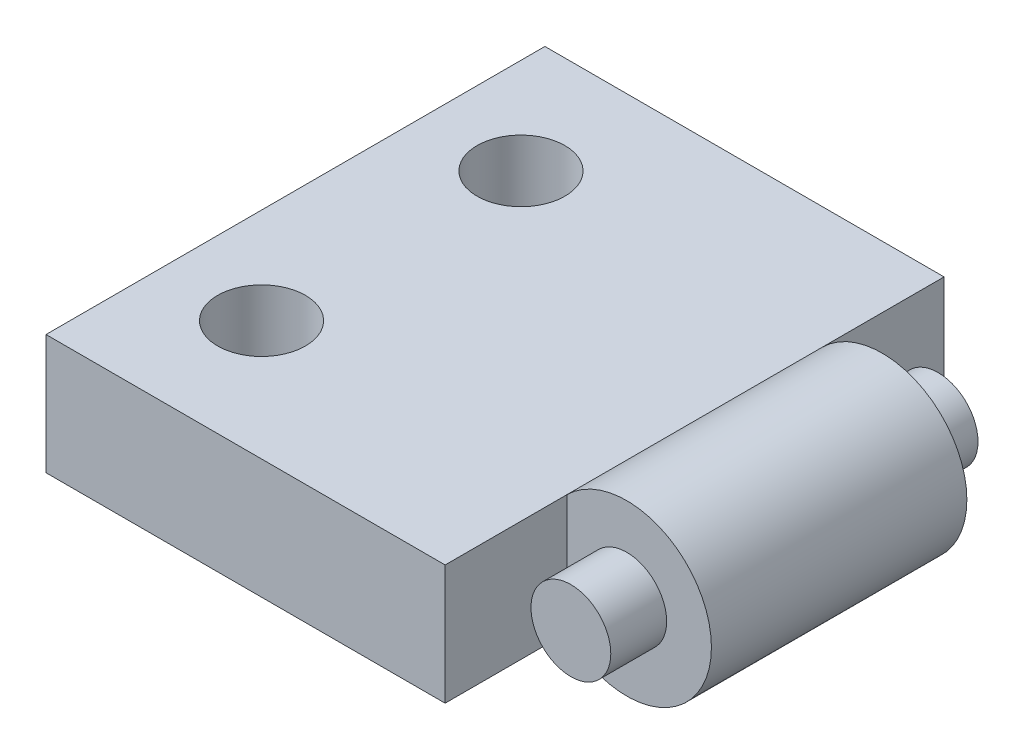
ISO-10303-21;
HEADER;
FILE_DESCRIPTION(('STEP AP214'),'2;1');
FILE_NAME('part.step','',(''),(''),'','','');
FILE_SCHEMA(('AUTOMOTIVE_DESIGN { 1 0 10303 214 1 1 1 1 }'));
ENDSEC;
DATA;
#1=APPLICATION_CONTEXT('core data for automotive mechanical design processes');
#2=APPLICATION_PROTOCOL_DEFINITION('international standard','automotive_design',2000,#1);
#3=PRODUCT_CONTEXT('',#1,'mechanical');
#4=PRODUCT('Part','Part','',(#3));
#5=PRODUCT_RELATED_PRODUCT_CATEGORY('part','',(#4));
#6=PRODUCT_DEFINITION_FORMATION('','',#4);
#7=PRODUCT_DEFINITION_CONTEXT('part definition',#1,'design');
#8=PRODUCT_DEFINITION('design','',#6,#7);
#9=PRODUCT_DEFINITION_SHAPE('','',#8);
#10=(LENGTH_UNIT() NAMED_UNIT(*) SI_UNIT(.MILLI.,.METRE.));
#11=(NAMED_UNIT(*) PLANE_ANGLE_UNIT() SI_UNIT($,.RADIAN.));
#12=(NAMED_UNIT(*) SI_UNIT($,.STERADIAN.) SOLID_ANGLE_UNIT());
#13=UNCERTAINTY_MEASURE_WITH_UNIT(LENGTH_MEASURE(1.E-05),#10,'distance_accuracy_value','');
#14=(GEOMETRIC_REPRESENTATION_CONTEXT(3) GLOBAL_UNCERTAINTY_ASSIGNED_CONTEXT((#13)) GLOBAL_UNIT_ASSIGNED_CONTEXT((#10,
#11,#12)) REPRESENTATION_CONTEXT('',''));
#15=CARTESIAN_POINT('',(0.,0.,0.));
#16=DIRECTION('',(0.,0.,1.));
#17=DIRECTION('',(1.,0.,0.));
#18=AXIS2_PLACEMENT_3D('',#15,#16,#17);
#19=CARTESIAN_POINT('',(12.7,3.81,0.));
#20=DIRECTION('',(-1.,0.,0.));
#21=DIRECTION('',(0.,0.,1.));
#22=AXIS2_PLACEMENT_3D('',#19,#20,#21);
#23=PLANE('',#22);
#24=DIRECTION('',(0.,1.,0.));
#25=VECTOR('',#24,1.);
#26=CARTESIAN_POINT('',(12.7,3.81,-12.0015));
#27=LINE('',#26,#25);
#28=CARTESIAN_POINT('',(12.7,0.,-12.0015));
#29=VERTEX_POINT('',#28);
#30=CARTESIAN_POINT('',(12.7,3.81,-12.0015));
#31=VERTEX_POINT('',#30);
#32=EDGE_CURVE('E101',#29,#31,#27,.T.);
#33=ORIENTED_EDGE('',*,*,#32,.F.);
#34=DIRECTION('',(0.,0.,-1.));
#35=VECTOR('',#34,1.);
#36=CARTESIAN_POINT('',(12.7,0.,0.));
#37=LINE('',#36,#35);
#38=CARTESIAN_POINT('',(12.6999999999999,0.,-15.875));
#39=VERTEX_POINT('',#38);
#40=EDGE_CURVE('E89',#29,#39,#37,.T.);
#41=ORIENTED_EDGE('',*,*,#40,.T.);
#42=DIRECTION('',(0.,-1.,0.));
#43=VECTOR('',#42,1.);
#44=CARTESIAN_POINT('',(12.6999999999999,3.81,-15.875));
#45=LINE('',#44,#43);
#46=CARTESIAN_POINT('',(12.6999999999999,3.81,-15.875));
#47=VERTEX_POINT('',#46);
#48=EDGE_CURVE('E140',#47,#39,#45,.T.);
#49=ORIENTED_EDGE('',*,*,#48,.F.);
#50=DIRECTION('',(0.,0.,-1.));
#51=VECTOR('',#50,1.);
#52=CARTESIAN_POINT('',(12.7,3.81,0.));
#53=LINE('',#52,#51);
#54=EDGE_CURVE('E50',#31,#47,#53,.T.);
#55=ORIENTED_EDGE('',*,*,#54,.F.);
#56=EDGE_LOOP('',(#33,#41,#49,#55));
#57=FACE_BOUND('',#56,.T.);
#58=ADVANCED_FACE('F35',(#57),#23,.F.);
#59=CARTESIAN_POINT('',(0.,3.81,-15.875));
#60=DIRECTION('',(0.,0.,-1.));
#61=DIRECTION('',(-1.,0.,0.));
#62=AXIS2_PLACEMENT_3D('',#59,#60,#61);
#63=PLANE('',#62);
#64=DIRECTION('',(1.,0.,0.));
#65=VECTOR('',#64,1.);
#66=CARTESIAN_POINT('',(0.,0.,-15.875));
#67=LINE('',#66,#65);
#68=CARTESIAN_POINT('',(0.,0.,-15.875));
#69=VERTEX_POINT('',#68);
#70=EDGE_CURVE('E95',#69,#39,#67,.T.);
#71=ORIENTED_EDGE('',*,*,#70,.F.);
#72=DIRECTION('',(0.,-1.,0.));
#73=VECTOR('',#72,1.);
#74=CARTESIAN_POINT('',(0.,3.81,-15.875));
#75=LINE('',#74,#73);
#76=CARTESIAN_POINT('',(0.,3.81,-15.875));
#77=VERTEX_POINT('',#76);
#78=EDGE_CURVE('E43',#77,#69,#75,.T.);
#79=ORIENTED_EDGE('',*,*,#78,.F.);
#80=DIRECTION('',(1.,0.,0.));
#81=VECTOR('',#80,1.);
#82=CARTESIAN_POINT('',(0.,3.81,-15.875));
#83=LINE('',#82,#81);
#84=EDGE_CURVE('E129',#77,#47,#83,.T.);
#85=ORIENTED_EDGE('',*,*,#84,.T.);
#86=ORIENTED_EDGE('',*,*,#48,.T.);
#87=EDGE_LOOP('',(#71,#79,#85,#86));
#88=FACE_BOUND('',#87,.T.);
#89=ADVANCED_FACE('F162',(#88),#63,.T.);
#90=CARTESIAN_POINT('',(0.,3.81,0.));
#91=DIRECTION('',(-1.,0.,0.));
#92=DIRECTION('',(0.,0.,1.));
#93=AXIS2_PLACEMENT_3D('',#90,#91,#92);
#94=PLANE('',#93);
#95=DIRECTION('',(0.,0.,-1.));
#96=VECTOR('',#95,1.);
#97=CARTESIAN_POINT('',(0.,0.,0.));
#98=LINE('',#97,#96);
#99=CARTESIAN_POINT('',(0.,0.,0.));
#100=VERTEX_POINT('',#99);
#101=EDGE_CURVE('E147',#100,#69,#98,.T.);
#102=ORIENTED_EDGE('',*,*,#101,.F.);
#103=DIRECTION('',(0.,-1.,0.));
#104=VECTOR('',#103,1.);
#105=CARTESIAN_POINT('',(0.,3.81,0.));
#106=LINE('',#105,#104);
#107=CARTESIAN_POINT('',(0.,3.81,0.));
#108=VERTEX_POINT('',#107);
#109=EDGE_CURVE('E155',#108,#100,#106,.T.);
#110=ORIENTED_EDGE('',*,*,#109,.F.);
#111=DIRECTION('',(0.,0.,-1.));
#112=VECTOR('',#111,1.);
#113=CARTESIAN_POINT('',(0.,3.81,0.));
#114=LINE('',#113,#112);
#115=EDGE_CURVE('E132',#108,#77,#114,.T.);
#116=ORIENTED_EDGE('',*,*,#115,.T.);
#117=ORIENTED_EDGE('',*,*,#78,.T.);
#118=EDGE_LOOP('',(#102,#110,#116,#117));
#119=FACE_BOUND('',#118,.T.);
#120=ADVANCED_FACE('F158',(#119),#94,.T.);
#121=CARTESIAN_POINT('',(0.,3.81,0.));
#122=DIRECTION('',(0.,0.,-1.));
#123=DIRECTION('',(-1.,0.,0.));
#124=AXIS2_PLACEMENT_3D('',#121,#122,#123);
#125=PLANE('',#124);
#126=DIRECTION('',(1.,0.,0.));
#127=VECTOR('',#126,1.);
#128=CARTESIAN_POINT('',(0.,0.,0.));
#129=LINE('',#128,#127);
#130=CARTESIAN_POINT('',(12.7,0.,0.));
#131=VERTEX_POINT('',#130);
#132=EDGE_CURVE('E97',#100,#131,#129,.T.);
#133=ORIENTED_EDGE('',*,*,#132,.T.);
#134=DIRECTION('',(0.,-1.,0.));
#135=VECTOR('',#134,1.);
#136=CARTESIAN_POINT('',(12.7,3.81,0.));
#137=LINE('',#136,#135);
#138=CARTESIAN_POINT('',(12.7,3.81,0.));
#139=VERTEX_POINT('',#138);
#140=EDGE_CURVE('E152',#139,#131,#137,.T.);
#141=ORIENTED_EDGE('',*,*,#140,.F.);
#142=DIRECTION('',(1.,0.,0.));
#143=VECTOR('',#142,1.);
#144=CARTESIAN_POINT('',(0.,3.81,0.));
#145=LINE('',#144,#143);
#146=EDGE_CURVE('E135',#108,#139,#145,.T.);
#147=ORIENTED_EDGE('',*,*,#146,.F.);
#148=ORIENTED_EDGE('',*,*,#109,.T.);
#149=EDGE_LOOP('',(#133,#141,#147,#148));
#150=FACE_BOUND('',#149,.T.);
#151=ADVANCED_FACE('F166',(#150),#125,.F.);
#152=CARTESIAN_POINT('',(3.04799999999996,3.81,-12.065));
#153=DIRECTION('',(0.,-1.,0.));
#154=DIRECTION('',(0.,0.,-1.));
#155=AXIS2_PLACEMENT_3D('',#152,#153,#154);
#156=CYLINDRICAL_SURFACE('',#155,1.397);
#157=CARTESIAN_POINT('',(3.04799999999996,3.81,-12.065));
#158=DIRECTION('',(0.,1.,0.));
#159=DIRECTION('',(0.,0.,1.));
#160=AXIS2_PLACEMENT_3D('',#157,#158,#159);
#161=CIRCLE('',#160,1.397);
#162=CARTESIAN_POINT('',(3.04799999999996,3.81,-13.462));
#163=VERTEX_POINT('',#162);
#164=EDGE_CURVE('E126',#163,#163,#161,.T.);
#165=CARTESIAN_POINT('',(3.04799999999996,0.,-12.065));
#166=DIRECTION('',(0.,1.,0.));
#167=DIRECTION('',(0.,0.,1.));
#168=AXIS2_PLACEMENT_3D('',#165,#166,#167);
#169=CIRCLE('',#168,1.397);
#170=CARTESIAN_POINT('',(3.04799999999996,0.,-13.462));
#171=VERTEX_POINT('',#170);
#172=EDGE_CURVE('E143',#171,#171,#169,.T.);
#173=CARTESIAN_POINT('',(3.04799999999996,3.81,-13.462));
#174=CARTESIAN_POINT('',(3.04799999999996,3.7703125,-13.462));
#175=CARTESIAN_POINT('',(3.04799999999996,3.730625,-13.462));
#176=CARTESIAN_POINT('',(3.04799999999996,3.65125,-13.462));
#177=CARTESIAN_POINT('',(3.04799999999996,3.6115625,-13.462));
#178=CARTESIAN_POINT('',(3.04799999999996,3.5321875,-13.462));
#179=CARTESIAN_POINT('',(3.04799999999996,3.4925,-13.462));
#180=CARTESIAN_POINT('',(3.04799999999996,3.413125,-13.462));
#181=CARTESIAN_POINT('',(3.04799999999996,3.3734375,-13.462));
#182=CARTESIAN_POINT('',(3.04799999999996,3.2940625,-13.462));
#183=CARTESIAN_POINT('',(3.04799999999996,3.254375,-13.462));
#184=CARTESIAN_POINT('',(3.04799999999996,3.175,-13.462));
#185=CARTESIAN_POINT('',(3.04799999999996,3.1353125,-13.462));
#186=CARTESIAN_POINT('',(3.04799999999996,3.0559375,-13.462));
#187=CARTESIAN_POINT('',(3.04799999999996,3.01625,-13.462));
#188=CARTESIAN_POINT('',(3.04799999999996,2.936875,-13.462));
#189=CARTESIAN_POINT('',(3.04799999999996,2.8971875,-13.462));
#190=CARTESIAN_POINT('',(3.04799999999996,2.8178125,-13.462));
#191=CARTESIAN_POINT('',(3.04799999999996,2.778125,-13.462));
#192=CARTESIAN_POINT('',(3.04799999999996,2.69875,-13.462));
#193=CARTESIAN_POINT('',(3.04799999999996,2.6590625,-13.462));
#194=CARTESIAN_POINT('',(3.04799999999996,2.5796875,-13.462));
#195=CARTESIAN_POINT('',(3.04799999999996,2.54,-13.462));
#196=CARTESIAN_POINT('',(3.04799999999996,2.460625,-13.462));
#197=CARTESIAN_POINT('',(3.04799999999996,2.4209375,-13.462));
#198=CARTESIAN_POINT('',(3.04799999999996,2.3415625,-13.462));
#199=CARTESIAN_POINT('',(3.04799999999996,2.301875,-13.462));
#200=CARTESIAN_POINT('',(3.04799999999996,2.2225,-13.462));
#201=CARTESIAN_POINT('',(3.04799999999996,2.1828125,-13.462));
#202=CARTESIAN_POINT('',(3.04799999999996,2.1034375,-13.462));
#203=CARTESIAN_POINT('',(3.04799999999996,2.06375,-13.462));
#204=CARTESIAN_POINT('',(3.04799999999996,1.984375,-13.462));
#205=CARTESIAN_POINT('',(3.04799999999996,1.9446875,-13.462));
#206=CARTESIAN_POINT('',(3.04799999999996,1.8653125,-13.462));
#207=CARTESIAN_POINT('',(3.04799999999996,1.825625,-13.462));
#208=CARTESIAN_POINT('',(3.04799999999996,1.74625,-13.462));
#209=CARTESIAN_POINT('',(3.04799999999996,1.7065625,-13.462));
#210=CARTESIAN_POINT('',(3.04799999999996,1.6271875,-13.462));
#211=CARTESIAN_POINT('',(3.04799999999996,1.5875,-13.462));
#212=CARTESIAN_POINT('',(3.04799999999996,1.508125,-13.462));
#213=CARTESIAN_POINT('',(3.04799999999996,1.4684375,-13.462));
#214=CARTESIAN_POINT('',(3.04799999999996,1.3890625,-13.462));
#215=CARTESIAN_POINT('',(3.04799999999996,1.349375,-13.462));
#216=CARTESIAN_POINT('',(3.04799999999996,1.27,-13.462));
#217=CARTESIAN_POINT('',(3.04799999999996,1.2303125,-13.462));
#218=CARTESIAN_POINT('',(3.04799999999996,1.1509375,-13.462));
#219=CARTESIAN_POINT('',(3.04799999999996,1.11125,-13.462));
#220=CARTESIAN_POINT('',(3.04799999999996,1.031875,-13.462));
#221=CARTESIAN_POINT('',(3.04799999999996,0.9921875,-13.462));
#222=CARTESIAN_POINT('',(3.04799999999996,0.9128125,-13.462));
#223=CARTESIAN_POINT('',(3.04799999999996,0.873125,-13.462));
#224=CARTESIAN_POINT('',(3.04799999999996,0.79375,-13.462));
#225=CARTESIAN_POINT('',(3.04799999999996,0.7540625,-13.462));
#226=CARTESIAN_POINT('',(3.04799999999996,0.6746875,-13.462));
#227=CARTESIAN_POINT('',(3.04799999999996,0.635,-13.462));
#228=CARTESIAN_POINT('',(3.04799999999996,0.555625,-13.462));
#229=CARTESIAN_POINT('',(3.04799999999996,0.5159375,-13.462));
#230=CARTESIAN_POINT('',(3.04799999999996,0.4365625,-13.462));
#231=CARTESIAN_POINT('',(3.04799999999996,0.396875,-13.462));
#232=CARTESIAN_POINT('',(3.04799999999996,0.3175,-13.462));
#233=CARTESIAN_POINT('',(3.04799999999996,0.2778125,-13.462));
#234=CARTESIAN_POINT('',(3.04799999999996,0.1984375,-13.462));
#235=CARTESIAN_POINT('',(3.04799999999996,0.15875,-13.462));
#236=CARTESIAN_POINT('',(3.04799999999996,0.0793749999999999,-13.462));
#237=CARTESIAN_POINT('',(3.04799999999996,0.0396874999999999,-13.462));
#238=CARTESIAN_POINT('',(3.04799999999996,0.,-13.462));
#239=B_SPLINE_CURVE_WITH_KNOTS('',3,(#173,#174,#175,#176,#177,#178,#179,#180,#181,#182,#183,
#184,#185,#186,#187,#188,#189,#190,#191,#192,#193,#194,#195,#196,#197,#198,#199,#200,#201,#202,
#203,#204,#205,#206,#207,#208,#209,#210,#211,#212,#213,#214,#215,#216,#217,#218,#219,#220,#221,
#222,#223,#224,#225,#226,#227,#228,#229,#230,#231,#232,#233,#234,#235,#236,#237,#238),
.UNSPECIFIED.,.F.,.F.,(4,2,2,2,2,2,2,2,2,2,2,2,2,2,2,2,2,2,2,2,2,2,2,2,2,2,2,2,2,2,2,2,4),(0.,
0.1190625,0.238125,0.3571875,0.47625,0.5953125,0.714375,0.8334375,0.9525,1.0715625,1.190625,
1.3096875,1.42875,1.5478125,1.666875,1.7859375,1.905,2.0240625,2.143125,2.2621875,2.38125,
2.5003125,2.619375,2.7384375,2.8575,2.9765625,3.095625,3.2146875,3.33375,3.4528125,3.571875,
3.6909375,3.81),.UNSPECIFIED.);
#240=EDGE_CURVE('BSEAM201',#163,#171,#239,.T.);
#241=ORIENTED_EDGE('',*,*,#164,.T.);
#242=ORIENTED_EDGE('',*,*,#172,.F.);
#243=ORIENTED_EDGE('',*,*,#240,.T.);
#244=ORIENTED_EDGE('',*,*,#240,.F.);
#245=EDGE_LOOP('',(#241,#243,#242,#244));
#246=FACE_BOUND('',#245,.T.);
#247=ADVANCED_FACE('F201',(#246),#156,.F.);
#248=CARTESIAN_POINT('',(3.04799999999999,3.81,-3.81));
#249=DIRECTION('',(0.,-1.,0.));
#250=DIRECTION('',(0.,0.,-1.));
#251=AXIS2_PLACEMENT_3D('',#248,#249,#250);
#252=CYLINDRICAL_SURFACE('',#251,1.397);
#253=CARTESIAN_POINT('',(3.04799999999999,3.81,-3.81));
#254=DIRECTION('',(0.,1.,0.));
#255=DIRECTION('',(0.,0.,1.));
#256=AXIS2_PLACEMENT_3D('',#253,#254,#255);
#257=CIRCLE('',#256,1.397);
#258=CARTESIAN_POINT('',(3.04799999999999,3.81,-5.207));
#259=VERTEX_POINT('',#258);
#260=EDGE_CURVE('E123',#259,#259,#257,.T.);
#261=CARTESIAN_POINT('',(3.04799999999999,0.,-3.81));
#262=DIRECTION('',(0.,1.,0.));
#263=DIRECTION('',(0.,0.,1.));
#264=AXIS2_PLACEMENT_3D('',#261,#262,#263);
#265=CIRCLE('',#264,1.397);
#266=CARTESIAN_POINT('',(3.04799999999999,0.,-5.207));
#267=VERTEX_POINT('',#266);
#268=EDGE_CURVE('E122',#267,#267,#265,.T.);
#269=CARTESIAN_POINT('',(3.04799999999999,3.81,-5.207));
#270=CARTESIAN_POINT('',(3.04799999999999,3.7703125,-5.207));
#271=CARTESIAN_POINT('',(3.04799999999999,3.730625,-5.207));
#272=CARTESIAN_POINT('',(3.04799999999999,3.65125,-5.207));
#273=CARTESIAN_POINT('',(3.04799999999999,3.6115625,-5.207));
#274=CARTESIAN_POINT('',(3.04799999999999,3.5321875,-5.207));
#275=CARTESIAN_POINT('',(3.04799999999999,3.4925,-5.207));
#276=CARTESIAN_POINT('',(3.04799999999999,3.413125,-5.207));
#277=CARTESIAN_POINT('',(3.04799999999999,3.3734375,-5.207));
#278=CARTESIAN_POINT('',(3.04799999999999,3.2940625,-5.207));
#279=CARTESIAN_POINT('',(3.04799999999999,3.254375,-5.207));
#280=CARTESIAN_POINT('',(3.04799999999999,3.175,-5.207));
#281=CARTESIAN_POINT('',(3.04799999999999,3.1353125,-5.207));
#282=CARTESIAN_POINT('',(3.04799999999999,3.0559375,-5.207));
#283=CARTESIAN_POINT('',(3.04799999999999,3.01625,-5.207));
#284=CARTESIAN_POINT('',(3.04799999999999,2.936875,-5.207));
#285=CARTESIAN_POINT('',(3.04799999999999,2.8971875,-5.207));
#286=CARTESIAN_POINT('',(3.04799999999999,2.8178125,-5.207));
#287=CARTESIAN_POINT('',(3.04799999999999,2.778125,-5.207));
#288=CARTESIAN_POINT('',(3.04799999999999,2.69875,-5.207));
#289=CARTESIAN_POINT('',(3.04799999999999,2.6590625,-5.207));
#290=CARTESIAN_POINT('',(3.04799999999999,2.5796875,-5.207));
#291=CARTESIAN_POINT('',(3.04799999999999,2.54,-5.207));
#292=CARTESIAN_POINT('',(3.04799999999999,2.460625,-5.207));
#293=CARTESIAN_POINT('',(3.04799999999999,2.4209375,-5.207));
#294=CARTESIAN_POINT('',(3.04799999999999,2.3415625,-5.207));
#295=CARTESIAN_POINT('',(3.04799999999999,2.301875,-5.207));
#296=CARTESIAN_POINT('',(3.04799999999999,2.2225,-5.207));
#297=CARTESIAN_POINT('',(3.04799999999999,2.1828125,-5.207));
#298=CARTESIAN_POINT('',(3.04799999999999,2.1034375,-5.207));
#299=CARTESIAN_POINT('',(3.04799999999999,2.06375,-5.207));
#300=CARTESIAN_POINT('',(3.04799999999999,1.984375,-5.207));
#301=CARTESIAN_POINT('',(3.04799999999999,1.9446875,-5.207));
#302=CARTESIAN_POINT('',(3.04799999999999,1.8653125,-5.207));
#303=CARTESIAN_POINT('',(3.04799999999999,1.825625,-5.207));
#304=CARTESIAN_POINT('',(3.04799999999999,1.74625,-5.207));
#305=CARTESIAN_POINT('',(3.04799999999999,1.7065625,-5.207));
#306=CARTESIAN_POINT('',(3.04799999999999,1.6271875,-5.207));
#307=CARTESIAN_POINT('',(3.04799999999999,1.5875,-5.207));
#308=CARTESIAN_POINT('',(3.04799999999999,1.508125,-5.207));
#309=CARTESIAN_POINT('',(3.04799999999999,1.4684375,-5.207));
#310=CARTESIAN_POINT('',(3.04799999999999,1.3890625,-5.207));
#311=CARTESIAN_POINT('',(3.04799999999999,1.349375,-5.207));
#312=CARTESIAN_POINT('',(3.04799999999999,1.27,-5.207));
#313=CARTESIAN_POINT('',(3.04799999999999,1.2303125,-5.207));
#314=CARTESIAN_POINT('',(3.04799999999999,1.1509375,-5.207));
#315=CARTESIAN_POINT('',(3.04799999999999,1.11125,-5.207));
#316=CARTESIAN_POINT('',(3.04799999999999,1.031875,-5.207));
#317=CARTESIAN_POINT('',(3.04799999999999,0.9921875,-5.207));
#318=CARTESIAN_POINT('',(3.04799999999999,0.9128125,-5.207));
#319=CARTESIAN_POINT('',(3.04799999999999,0.873125,-5.207));
#320=CARTESIAN_POINT('',(3.04799999999999,0.79375,-5.207));
#321=CARTESIAN_POINT('',(3.04799999999999,0.7540625,-5.207));
#322=CARTESIAN_POINT('',(3.04799999999999,0.6746875,-5.207));
#323=CARTESIAN_POINT('',(3.04799999999999,0.635,-5.207));
#324=CARTESIAN_POINT('',(3.04799999999999,0.555625,-5.207));
#325=CARTESIAN_POINT('',(3.04799999999999,0.5159375,-5.207));
#326=CARTESIAN_POINT('',(3.04799999999999,0.4365625,-5.207));
#327=CARTESIAN_POINT('',(3.04799999999999,0.396875,-5.207));
#328=CARTESIAN_POINT('',(3.04799999999999,0.3175,-5.207));
#329=CARTESIAN_POINT('',(3.04799999999999,0.2778125,-5.207));
#330=CARTESIAN_POINT('',(3.04799999999999,0.1984375,-5.207));
#331=CARTESIAN_POINT('',(3.04799999999999,0.15875,-5.207));
#332=CARTESIAN_POINT('',(3.04799999999999,0.0793749999999999,-5.207));
#333=CARTESIAN_POINT('',(3.04799999999999,0.0396874999999999,-5.207));
#334=CARTESIAN_POINT('',(3.04799999999999,0.,-5.207));
#335=B_SPLINE_CURVE_WITH_KNOTS('',3,(#269,#270,#271,#272,#273,#274,#275,#276,#277,#278,#279,
#280,#281,#282,#283,#284,#285,#286,#287,#288,#289,#290,#291,#292,#293,#294,#295,#296,#297,#298,
#299,#300,#301,#302,#303,#304,#305,#306,#307,#308,#309,#310,#311,#312,#313,#314,#315,#316,#317,
#318,#319,#320,#321,#322,#323,#324,#325,#326,#327,#328,#329,#330,#331,#332,#333,#334),
.UNSPECIFIED.,.F.,.F.,(4,2,2,2,2,2,2,2,2,2,2,2,2,2,2,2,2,2,2,2,2,2,2,2,2,2,2,2,2,2,2,2,4),(0.,
0.1190625,0.238125,0.3571875,0.47625,0.5953125,0.714375,0.8334375,0.9525,1.0715625,1.190625,
1.3096875,1.42875,1.5478125,1.666875,1.7859375,1.905,2.0240625,2.143125,2.2621875,2.38125,
2.5003125,2.619375,2.7384375,2.8575,2.9765625,3.095625,3.2146875,3.33375,3.4528125,3.571875,
3.6909375,3.81),.UNSPECIFIED.);
#336=EDGE_CURVE('BSEAM37',#259,#267,#335,.T.);
#337=ORIENTED_EDGE('',*,*,#260,.T.);
#338=ORIENTED_EDGE('',*,*,#268,.F.);
#339=ORIENTED_EDGE('',*,*,#336,.T.);
#340=ORIENTED_EDGE('',*,*,#336,.F.);
#341=EDGE_LOOP('',(#337,#339,#338,#340));
#342=FACE_BOUND('',#341,.T.);
#343=ADVANCED_FACE('F37',(#342),#252,.F.);
#344=CARTESIAN_POINT('',(12.7,0.,-3.8735));
#345=VERTEX_POINT('',#344);
#346=EDGE_CURVE('E99',#131,#345,#37,.T.);
#347=ORIENTED_EDGE('',*,*,#346,.T.);
#348=DIRECTION('',(0.,1.,0.));
#349=VECTOR('',#348,1.);
#350=CARTESIAN_POINT('',(12.7,3.81,-3.8735));
#351=LINE('',#350,#349);
#352=CARTESIAN_POINT('',(12.7,3.81,-3.8735));
#353=VERTEX_POINT('',#352);
#354=EDGE_CURVE('E58',#345,#353,#351,.T.);
#355=ORIENTED_EDGE('',*,*,#354,.T.);
#356=EDGE_CURVE('E138',#139,#353,#53,.T.);
#357=ORIENTED_EDGE('',*,*,#356,.F.);
#358=ORIENTED_EDGE('',*,*,#140,.T.);
#359=EDGE_LOOP('',(#347,#355,#357,#358));
#360=FACE_BOUND('',#359,.T.);
#361=ADVANCED_FACE('F187',(#360),#23,.F.);
#362=CARTESIAN_POINT('',(0.,3.81,0.));
#363=DIRECTION('',(0.,1.,0.));
#364=DIRECTION('',(0.,0.,1.));
#365=AXIS2_PLACEMENT_3D('',#362,#363,#364);
#366=PLANE('',#365);
#367=ORIENTED_EDGE('',*,*,#260,.F.);
#368=EDGE_LOOP('',(#367));
#369=FACE_BOUND('',#368,.T.);
#370=ORIENTED_EDGE('',*,*,#164,.F.);
#371=EDGE_LOOP('',(#370));
#372=FACE_BOUND('',#371,.T.);
#373=ORIENTED_EDGE('',*,*,#84,.F.);
#374=ORIENTED_EDGE('',*,*,#115,.F.);
#375=ORIENTED_EDGE('',*,*,#146,.T.);
#376=ORIENTED_EDGE('',*,*,#356,.T.);
#377=DIRECTION('',(0.,0.,1.));
#378=VECTOR('',#377,1.);
#379=CARTESIAN_POINT('',(12.7,3.81,-12.0015));
#380=LINE('',#379,#378);
#381=EDGE_CURVE('E105',#31,#353,#380,.T.);
#382=ORIENTED_EDGE('',*,*,#381,.F.);
#383=ORIENTED_EDGE('',*,*,#54,.T.);
#384=EDGE_LOOP('',(#373,#374,#375,#376,#382,#383));
#385=FACE_BOUND('',#384,.T.);
#386=ADVANCED_FACE('F169',(#369,#372,#385),#366,.T.);
#387=CARTESIAN_POINT('',(0.,0.,0.));
#388=DIRECTION('',(0.,1.,0.));
#389=DIRECTION('',(0.,0.,1.));
#390=AXIS2_PLACEMENT_3D('',#387,#388,#389);
#391=PLANE('',#390);
#392=ORIENTED_EDGE('',*,*,#268,.T.);
#393=EDGE_LOOP('',(#392));
#394=FACE_BOUND('',#393,.T.);
#395=ORIENTED_EDGE('',*,*,#172,.T.);
#396=EDGE_LOOP('',(#395));
#397=FACE_BOUND('',#396,.T.);
#398=ORIENTED_EDGE('',*,*,#70,.T.);
#399=ORIENTED_EDGE('',*,*,#40,.F.);
#400=EDGE_CURVE('E92',#345,#29,#37,.T.);
#401=ORIENTED_EDGE('',*,*,#400,.F.);
#402=ORIENTED_EDGE('',*,*,#346,.F.);
#403=ORIENTED_EDGE('',*,*,#132,.F.);
#404=ORIENTED_EDGE('',*,*,#101,.T.);
#405=EDGE_LOOP('',(#398,#399,#401,#402,#403,#404));
#406=FACE_BOUND('',#405,.T.);
#407=ADVANCED_FACE('F90',(#394,#397,#406),#391,.F.);
#408=CARTESIAN_POINT('',(0.,0.,-12.0015));
#409=DIRECTION('',(0.,0.,1.));
#410=DIRECTION('',(1.,0.,0.));
#411=AXIS2_PLACEMENT_3D('',#408,#409,#410);
#412=PLANE('',#411);
#413=CARTESIAN_POINT('',(14.605,1.905,-12.0015));
#414=DIRECTION('',(0.,0.,1.));
#415=DIRECTION('',(1.,0.,0.));
#416=AXIS2_PLACEMENT_3D('',#413,#414,#415);
#417=CIRCLE('',#416,1.27);
#418=CARTESIAN_POINT('',(15.875,1.905,-12.0015));
#419=VERTEX_POINT('',#418);
#420=EDGE_CURVE('E11',#419,#419,#417,.F.);
#421=ORIENTED_EDGE('',*,*,#420,.F.);
#422=EDGE_LOOP('',(#421));
#423=FACE_BOUND('',#422,.T.);
#424=CARTESIAN_POINT('',(14.605,1.905,-12.0015));
#425=DIRECTION('',(0.,0.,1.));
#426=DIRECTION('',(1.,0.,0.));
#427=AXIS2_PLACEMENT_3D('',#424,#425,#426);
#428=CIRCLE('',#427,2.69407683632075);
#429=EDGE_CURVE('E111',#29,#31,#428,.T.);
#430=ORIENTED_EDGE('',*,*,#429,.F.);
#431=ORIENTED_EDGE('',*,*,#32,.T.);
#432=EDGE_LOOP('',(#430,#431));
#433=FACE_BOUND('',#432,.T.);
#434=ADVANCED_FACE('F114',(#423,#433),#412,.F.);
#435=CARTESIAN_POINT('',(0.,0.,-3.8735));
#436=DIRECTION('',(0.,0.,1.));
#437=DIRECTION('',(1.,0.,0.));
#438=AXIS2_PLACEMENT_3D('',#435,#436,#437);
#439=PLANE('',#438);
#440=CARTESIAN_POINT('',(14.605,1.905,-3.8735));
#441=DIRECTION('',(0.,0.,1.));
#442=DIRECTION('',(1.,0.,0.));
#443=AXIS2_PLACEMENT_3D('',#440,#441,#442);
#444=CIRCLE('',#443,1.27);
#445=CARTESIAN_POINT('',(15.875,1.905,-3.8735));
#446=VERTEX_POINT('',#445);
#447=EDGE_CURVE('E266',#446,#446,#444,.T.);
#448=ORIENTED_EDGE('',*,*,#447,.F.);
#449=EDGE_LOOP('',(#448));
#450=FACE_BOUND('',#449,.T.);
#451=ORIENTED_EDGE('',*,*,#354,.F.);
#452=CARTESIAN_POINT('',(14.605,1.905,-3.8735));
#453=DIRECTION('',(0.,0.,1.));
#454=DIRECTION('',(1.,0.,0.));
#455=AXIS2_PLACEMENT_3D('',#452,#453,#454);
#456=CIRCLE('',#455,2.69407683632075);
#457=EDGE_CURVE('E113',#345,#353,#456,.T.);
#458=ORIENTED_EDGE('',*,*,#457,.T.);
#459=EDGE_LOOP('',(#451,#458));
#460=FACE_BOUND('',#459,.T.);
#461=ADVANCED_FACE('F171',(#450,#460),#439,.T.);
#462=CARTESIAN_POINT('',(14.605,1.905,-12.0015));
#463=DIRECTION('',(0.,0.,1.));
#464=DIRECTION('',(1.,0.,0.));
#465=AXIS2_PLACEMENT_3D('',#462,#463,#464);
#466=CYLINDRICAL_SURFACE('',#465,2.69407683632075);
#467=ORIENTED_EDGE('',*,*,#429,.T.);
#468=ORIENTED_EDGE('',*,*,#381,.T.);
#469=ORIENTED_EDGE('',*,*,#457,.F.);
#470=ORIENTED_EDGE('',*,*,#400,.T.);
#471=EDGE_LOOP('',(#467,#468,#469,#470));
#472=FACE_BOUND('',#471,.T.);
#473=ADVANCED_FACE('F109',(#472),#466,.T.);
#474=CARTESIAN_POINT('',(14.605,1.905,-2.0955));
#475=DIRECTION('',(0.,0.,-1.));
#476=DIRECTION('',(-1.,0.,0.));
#477=AXIS2_PLACEMENT_3D('',#474,#475,#476);
#478=CYLINDRICAL_SURFACE('',#477,1.27);
#479=CARTESIAN_POINT('',(14.605,1.905,-2.0955));
#480=DIRECTION('',(0.,0.,1.));
#481=DIRECTION('',(1.,0.,0.));
#482=AXIS2_PLACEMENT_3D('',#479,#480,#481);
#483=CIRCLE('',#482,1.27);
#484=CARTESIAN_POINT('',(15.875,1.905,-2.0955));
#485=VERTEX_POINT('',#484);
#486=EDGE_CURVE('E117',#485,#485,#483,.T.);
#487=ORIENTED_EDGE('',*,*,#486,.F.);
#488=EDGE_LOOP('',(#487));
#489=FACE_BOUND('',#488,.T.);
#490=ORIENTED_EDGE('',*,*,#447,.T.);
#491=EDGE_LOOP('',(#490));
#492=FACE_BOUND('',#491,.T.);
#493=ADVANCED_FACE('F179',(#489,#492),#478,.T.);
#494=CARTESIAN_POINT('',(14.605,1.905,-2.0955));
#495=DIRECTION('',(0.,0.,1.));
#496=DIRECTION('',(1.,0.,0.));
#497=AXIS2_PLACEMENT_3D('',#494,#495,#496);
#498=PLANE('',#497);
#499=ORIENTED_EDGE('',*,*,#486,.T.);
#500=EDGE_LOOP('',(#499));
#501=FACE_BOUND('',#500,.T.);
#502=ADVANCED_FACE('F232',(#501),#498,.T.);
#503=CARTESIAN_POINT('',(14.605,1.905,-13.7795));
#504=DIRECTION('',(0.,0.,1.));
#505=DIRECTION('',(1.,0.,0.));
#506=AXIS2_PLACEMENT_3D('',#503,#504,#505);
#507=CYLINDRICAL_SURFACE('',#506,1.27);
#508=CARTESIAN_POINT('',(14.605,1.905,-13.7795));
#509=DIRECTION('',(0.,0.,-1.));
#510=DIRECTION('',(-1.,0.,0.));
#511=AXIS2_PLACEMENT_3D('',#508,#509,#510);
#512=CIRCLE('',#511,1.27);
#513=CARTESIAN_POINT('',(13.335,1.905,-13.7795));
#514=VERTEX_POINT('',#513);
#515=EDGE_CURVE('E267',#514,#514,#512,.T.);
#516=ORIENTED_EDGE('',*,*,#515,.F.);
#517=EDGE_LOOP('',(#516));
#518=FACE_BOUND('',#517,.T.);
#519=ORIENTED_EDGE('',*,*,#420,.T.);
#520=EDGE_LOOP('',(#519));
#521=FACE_BOUND('',#520,.T.);
#522=ADVANCED_FACE('F237',(#518,#521),#507,.T.);
#523=CARTESIAN_POINT('',(14.605,1.905,-13.7795));
#524=DIRECTION('',(0.,0.,-1.));
#525=DIRECTION('',(-1.,0.,0.));
#526=AXIS2_PLACEMENT_3D('',#523,#524,#525);
#527=PLANE('',#526);
#528=ORIENTED_EDGE('',*,*,#515,.T.);
#529=EDGE_LOOP('',(#528));
#530=FACE_BOUND('',#529,.T.);
#531=ADVANCED_FACE('F242',(#530),#527,.T.);
#532=CLOSED_SHELL('',(#58,#89,#120,#151,#247,#343,#361,#386,#407,#434,#461,#473,#493,#502,#522,#531));
#533=MANIFOLD_SOLID_BREP('B2',#532);
#534=ADVANCED_BREP_SHAPE_REPRESENTATION('',(#18,#533),#14);
#535=SHAPE_DEFINITION_REPRESENTATION(#9,#534);
ENDSEC;
END-ISO-10303-21;
